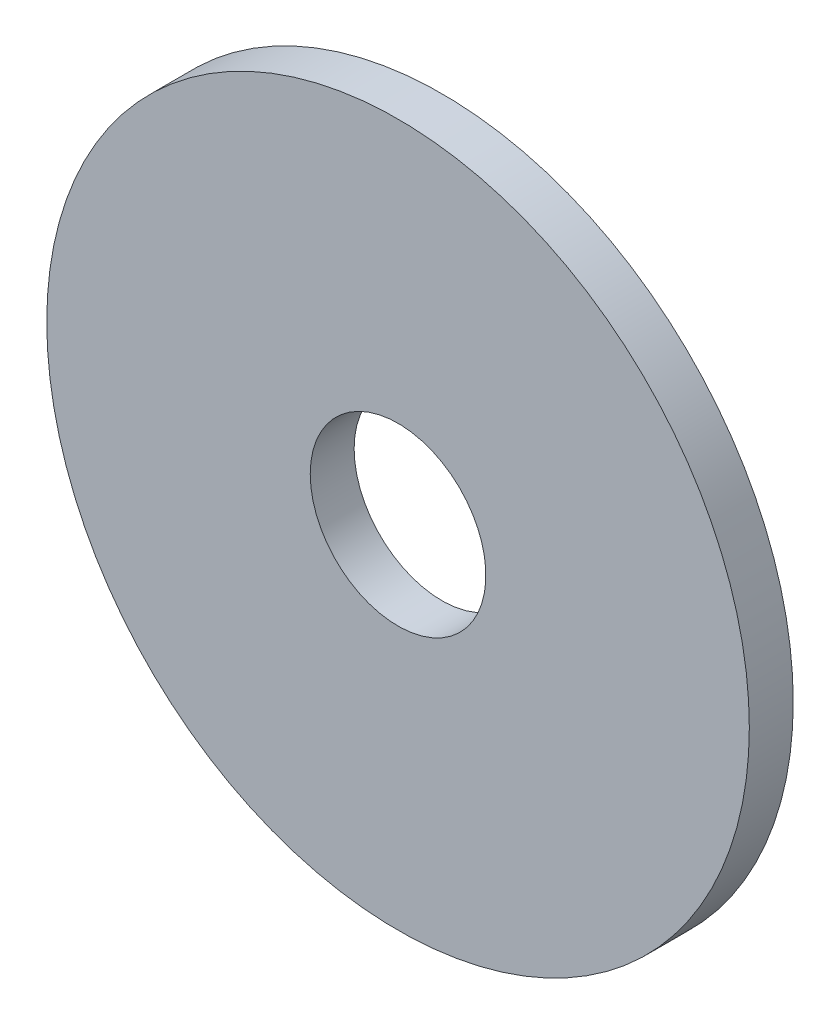
ISO-10303-21;
HEADER;
FILE_DESCRIPTION(('STEP AP214'),'2;1');
FILE_NAME('part.step','',(''),(''),'','','');
FILE_SCHEMA(('AUTOMOTIVE_DESIGN { 1 0 10303 214 1 1 1 1 }'));
ENDSEC;
DATA;
#1=APPLICATION_CONTEXT('core data for automotive mechanical design processes');
#2=APPLICATION_PROTOCOL_DEFINITION('international standard','automotive_design',2000,#1);
#3=PRODUCT_CONTEXT('',#1,'mechanical');
#4=PRODUCT('Part','Part','',(#3));
#5=PRODUCT_RELATED_PRODUCT_CATEGORY('part','',(#4));
#6=PRODUCT_DEFINITION_FORMATION('','',#4);
#7=PRODUCT_DEFINITION_CONTEXT('part definition',#1,'design');
#8=PRODUCT_DEFINITION('design','',#6,#7);
#9=PRODUCT_DEFINITION_SHAPE('','',#8);
#10=(LENGTH_UNIT() NAMED_UNIT(*) SI_UNIT(.MILLI.,.METRE.));
#11=(NAMED_UNIT(*) PLANE_ANGLE_UNIT() SI_UNIT($,.RADIAN.));
#12=(NAMED_UNIT(*) SI_UNIT($,.STERADIAN.) SOLID_ANGLE_UNIT());
#13=UNCERTAINTY_MEASURE_WITH_UNIT(LENGTH_MEASURE(1.E-05),#10,'distance_accuracy_value','');
#14=(GEOMETRIC_REPRESENTATION_CONTEXT(3) GLOBAL_UNCERTAINTY_ASSIGNED_CONTEXT((#13)) GLOBAL_UNIT_ASSIGNED_CONTEXT((#10,
#11,#12)) REPRESENTATION_CONTEXT('',''));
#15=CARTESIAN_POINT('',(0.,0.,0.));
#16=DIRECTION('',(0.,0.,1.));
#17=DIRECTION('',(1.,0.,0.));
#18=AXIS2_PLACEMENT_3D('',#15,#16,#17);
#19=CARTESIAN_POINT('',(68.3982464909084,3.21438697688714,0.79375));
#20=DIRECTION('',(0.,0.,-1.));
#21=DIRECTION('',(-1.,0.,0.));
#22=AXIS2_PLACEMENT_3D('',#19,#20,#21);
#23=CYLINDRICAL_SURFACE('',#22,6.35);
#24=CARTESIAN_POINT('',(68.3982464909084,3.21438697688714,0.79375));
#25=DIRECTION('',(0.,0.,1.));
#26=DIRECTION('',(1.,0.,0.));
#27=AXIS2_PLACEMENT_3D('',#24,#25,#26);
#28=CIRCLE('',#27,6.35);
#29=CARTESIAN_POINT('',(74.7482464909084,3.21438697688714,0.79375));
#30=VERTEX_POINT('',#29);
#31=EDGE_CURVE('E10',#30,#30,#28,.T.);
#32=ORIENTED_EDGE('',*,*,#31,.F.);
#33=EDGE_LOOP('',(#32));
#34=FACE_BOUND('',#33,.T.);
#35=CARTESIAN_POINT('',(68.3982464909084,3.21438697688714,0.));
#36=DIRECTION('',(0.,0.,1.));
#37=DIRECTION('',(1.,0.,0.));
#38=AXIS2_PLACEMENT_3D('',#35,#36,#37);
#39=CIRCLE('',#38,6.35);
#40=CARTESIAN_POINT('',(74.7482464909084,3.21438697688714,0.));
#41=VERTEX_POINT('',#40);
#42=EDGE_CURVE('E34',#41,#41,#39,.T.);
#43=ORIENTED_EDGE('',*,*,#42,.T.);
#44=EDGE_LOOP('',(#43));
#45=FACE_BOUND('',#44,.T.);
#46=ADVANCED_FACE('F31',(#34,#45),#23,.T.);
#47=CARTESIAN_POINT('',(68.3982464909084,3.21438697688714,0.79375));
#48=DIRECTION('',(0.,0.,1.));
#49=DIRECTION('',(1.,0.,0.));
#50=AXIS2_PLACEMENT_3D('',#47,#48,#49);
#51=PLANE('',#50);
#52=CARTESIAN_POINT('',(68.3982464909084,3.21438697688714,0.79375));
#53=DIRECTION('',(0.,0.,-1.));
#54=DIRECTION('',(-1.,0.,0.));
#55=AXIS2_PLACEMENT_3D('',#52,#53,#54);
#56=CIRCLE('',#55,1.5875);
#57=CARTESIAN_POINT('',(66.8107464909084,3.21438697688714,0.79375));
#58=VERTEX_POINT('',#57);
#59=EDGE_CURVE('E41',#58,#58,#56,.T.);
#60=ORIENTED_EDGE('',*,*,#59,.T.);
#61=EDGE_LOOP('',(#60));
#62=FACE_BOUND('',#61,.T.);
#63=ORIENTED_EDGE('',*,*,#31,.T.);
#64=EDGE_LOOP('',(#63));
#65=FACE_BOUND('',#64,.T.);
#66=ADVANCED_FACE('F49',(#62,#65),#51,.T.);
#67=CARTESIAN_POINT('',(68.3982464909084,3.21438697688714,0.));
#68=DIRECTION('',(0.,0.,1.));
#69=DIRECTION('',(1.,0.,0.));
#70=AXIS2_PLACEMENT_3D('',#67,#68,#69);
#71=PLANE('',#70);
#72=CARTESIAN_POINT('',(68.3982464909084,3.21438697688714,0.));
#73=DIRECTION('',(0.,0.,-1.));
#74=DIRECTION('',(-1.,0.,0.));
#75=AXIS2_PLACEMENT_3D('',#72,#73,#74);
#76=CIRCLE('',#75,1.5875);
#77=CARTESIAN_POINT('',(66.8107464909084,3.21438697688714,0.));
#78=VERTEX_POINT('',#77);
#79=EDGE_CURVE('E43',#78,#78,#76,.T.);
#80=ORIENTED_EDGE('',*,*,#79,.F.);
#81=EDGE_LOOP('',(#80));
#82=FACE_BOUND('',#81,.T.);
#83=ORIENTED_EDGE('',*,*,#42,.F.);
#84=EDGE_LOOP('',(#83));
#85=FACE_BOUND('',#84,.T.);
#86=ADVANCED_FACE('F54',(#82,#85),#71,.F.);
#87=CARTESIAN_POINT('',(68.3982464909084,3.21438697688714,0.79375));
#88=DIRECTION('',(0.,0.,-1.));
#89=DIRECTION('',(-1.,0.,0.));
#90=AXIS2_PLACEMENT_3D('',#87,#88,#89);
#91=CYLINDRICAL_SURFACE('',#90,1.5875);
#92=ORIENTED_EDGE('',*,*,#59,.F.);
#93=EDGE_LOOP('',(#92));
#94=FACE_BOUND('',#93,.T.);
#95=ORIENTED_EDGE('',*,*,#79,.T.);
#96=EDGE_LOOP('',(#95));
#97=FACE_BOUND('',#96,.T.);
#98=ADVANCED_FACE('F51',(#94,#97),#91,.F.);
#99=CLOSED_SHELL('',(#46,#66,#86,#98));
#100=MANIFOLD_SOLID_BREP('B2',#99);
#101=ADVANCED_BREP_SHAPE_REPRESENTATION('',(#18,#100),#14);
#102=SHAPE_DEFINITION_REPRESENTATION(#9,#101);
ENDSEC;
END-ISO-10303-21;
